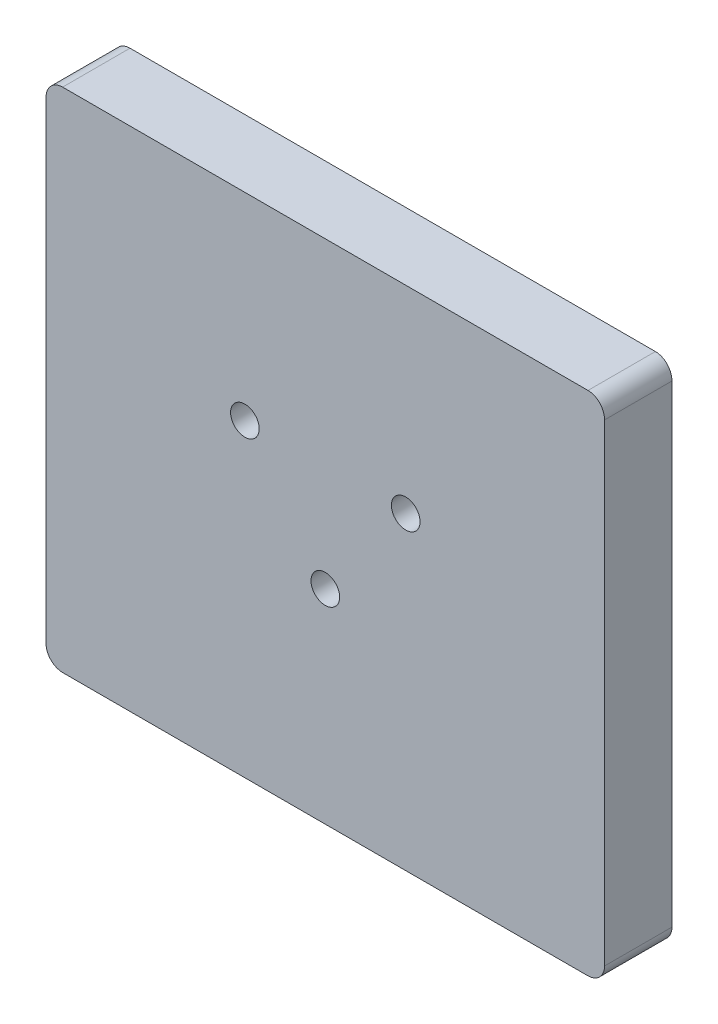
ISO-10303-21;
HEADER;
FILE_DESCRIPTION(('STEP AP214'),'2;1');
FILE_NAME('part.step','',(''),(''),'','','');
FILE_SCHEMA(('AUTOMOTIVE_DESIGN { 1 0 10303 214 1 1 1 1 }'));
ENDSEC;
DATA;
#1=APPLICATION_CONTEXT('core data for automotive mechanical design processes');
#2=APPLICATION_PROTOCOL_DEFINITION('international standard','automotive_design',2000,#1);
#3=PRODUCT_CONTEXT('',#1,'mechanical');
#4=PRODUCT('Part','Part','',(#3));
#5=PRODUCT_RELATED_PRODUCT_CATEGORY('part','',(#4));
#6=PRODUCT_DEFINITION_FORMATION('','',#4);
#7=PRODUCT_DEFINITION_CONTEXT('part definition',#1,'design');
#8=PRODUCT_DEFINITION('design','',#6,#7);
#9=PRODUCT_DEFINITION_SHAPE('','',#8);
#10=(LENGTH_UNIT() NAMED_UNIT(*) SI_UNIT(.MILLI.,.METRE.));
#11=(NAMED_UNIT(*) PLANE_ANGLE_UNIT() SI_UNIT($,.RADIAN.));
#12=(NAMED_UNIT(*) SI_UNIT($,.STERADIAN.) SOLID_ANGLE_UNIT());
#13=UNCERTAINTY_MEASURE_WITH_UNIT(LENGTH_MEASURE(1.E-05),#10,'distance_accuracy_value','');
#14=(GEOMETRIC_REPRESENTATION_CONTEXT(3) GLOBAL_UNCERTAINTY_ASSIGNED_CONTEXT((#13)) GLOBAL_UNIT_ASSIGNED_CONTEXT((#10,
#11,#12)) REPRESENTATION_CONTEXT('',''));
#15=CARTESIAN_POINT('',(0.,0.,0.));
#16=DIRECTION('',(0.,0.,1.));
#17=DIRECTION('',(1.,0.,0.));
#18=AXIS2_PLACEMENT_3D('',#15,#16,#17);
#19=CARTESIAN_POINT('',(0.,-1.26259003663461E-12,-50.8));
#20=DIRECTION('',(0.,0.,-1.));
#21=DIRECTION('',(0.,1.,0.));
#22=AXIS2_PLACEMENT_3D('',#19,#20,#21);
#23=PLANE('',#22);
#24=CARTESIAN_POINT('',(-6.89480048776039E-10,140.918830549792,-50.8000000000035));
#25=DIRECTION('',(0.,0.,-1.));
#26=DIRECTION('',(0.,1.,0.));
#27=AXIS2_PLACEMENT_3D('',#24,#25,#26);
#28=CIRCLE('',#27,10.795);
#29=CARTESIAN_POINT('',(-6.89480048776039E-10,151.713830549792,-50.8000000000037));
#30=VERTEX_POINT('',#29);
#31=EDGE_CURVE('E298',#30,#30,#28,.T.);
#32=ORIENTED_EDGE('',*,*,#31,.T.);
#33=EDGE_LOOP('',(#32));
#34=FACE_BOUND('',#33,.T.);
#35=CARTESIAN_POINT('',(-60.6219373498962,220.459221855586,-50.8000000000055));
#36=DIRECTION('',(0.,0.,-1.));
#37=DIRECTION('',(0.,1.,0.));
#38=AXIS2_PLACEMENT_3D('',#35,#36,#37);
#39=CIRCLE('',#38,10.795);
#40=CARTESIAN_POINT('',(-60.6219373498962,231.254221855586,-50.8000000000057));
#41=VERTEX_POINT('',#40);
#42=EDGE_CURVE('E237',#41,#41,#39,.T.);
#43=ORIENTED_EDGE('',*,*,#42,.T.);
#44=EDGE_LOOP('',(#43));
#45=FACE_BOUND('',#44,.T.);
#46=CARTESIAN_POINT('',(60.6219373498894,220.459221855586,-50.8000000000055));
#47=DIRECTION('',(0.,0.,-1.));
#48=DIRECTION('',(0.,1.,0.));
#49=AXIS2_PLACEMENT_3D('',#46,#47,#48);
#50=CIRCLE('',#49,10.795);
#51=CARTESIAN_POINT('',(60.6219373498894,231.254221855586,-50.8000000000057));
#52=VERTEX_POINT('',#51);
#53=EDGE_CURVE('E300',#52,#52,#50,.T.);
#54=ORIENTED_EDGE('',*,*,#53,.T.);
#55=EDGE_LOOP('',(#54));
#56=FACE_BOUND('',#55,.T.);
#57=CARTESIAN_POINT('',(197.793895445054,0.,-50.8000000000003));
#58=DIRECTION('',(0.,0.,1.));
#59=DIRECTION('',(-1.,-3.80671022278096E-13,0.));
#60=AXIS2_PLACEMENT_3D('',#57,#58,#59);
#61=ELLIPSE('',#60,12.7270401618867,12.7);
#62=CARTESIAN_POINT('',(210.520935606941,0.,-50.8));
#63=VERTEX_POINT('',#62);
#64=CARTESIAN_POINT('',(197.793895445054,-12.7,-50.7999999999996));
#65=VERTEX_POINT('',#64);
#66=EDGE_CURVE('E196',#63,#65,#61,.F.);
#67=ORIENTED_EDGE('',*,*,#66,.F.);
#68=DIRECTION('',(0.,1.,0.));
#69=VECTOR('',#68,1.);
#70=CARTESIAN_POINT('',(210.520935606941,-12.7,-50.8));
#71=LINE('',#70,#69);
#72=CARTESIAN_POINT('',(210.520935606941,356.505933384394,-50.8000000000088));
#73=VERTEX_POINT('',#72);
#74=EDGE_CURVE('E53',#63,#73,#71,.T.);
#75=ORIENTED_EDGE('',*,*,#74,.T.);
#76=CARTESIAN_POINT('',(197.793895445055,356.261568489364,-50.8000000000088));
#77=DIRECTION('',(0.,0.,-1.));
#78=DIRECTION('',(0.215862503296012,0.976423770537557,0.));
#79=AXIS2_PLACEMENT_3D('',#76,#77,#78);
#80=ELLIPSE('',#79,13.2682097322358,12.7);
#81=CARTESIAN_POINT('',(198.028752515511,369.503843151079,-50.8000000000091));
#82=VERTEX_POINT('',#81);
#83=EDGE_CURVE('E184',#82,#73,#80,.T.);
#84=ORIENTED_EDGE('',*,*,#83,.F.);
#85=DIRECTION('',(1.,0.,0.));
#86=VECTOR('',#85,1.);
#87=CARTESIAN_POINT('',(254.,369.50384315108,-50.8000000000095));
#88=LINE('',#87,#86);
#89=CARTESIAN_POINT('',(-198.028752515511,369.50384315108,-50.8000000000003));
#90=VERTEX_POINT('',#89);
#91=EDGE_CURVE('E11',#82,#90,#88,.F.);
#92=ORIENTED_EDGE('',*,*,#91,.T.);
#93=CARTESIAN_POINT('',(-197.793895445055,356.261568489364,-50.8000000000088));
#94=DIRECTION('',(0.,0.,-1.));
#95=DIRECTION('',(-0.215862503296012,0.976423770537557,0.));
#96=AXIS2_PLACEMENT_3D('',#93,#94,#95);
#97=ELLIPSE('',#96,13.2682097322358,12.7);
#98=CARTESIAN_POINT('',(-210.520935606941,356.505933384394,-50.8000000000088));
#99=VERTEX_POINT('',#98);
#100=EDGE_CURVE('E60',#99,#90,#97,.T.);
#101=ORIENTED_EDGE('',*,*,#100,.F.);
#102=DIRECTION('',(0.,1.,0.));
#103=VECTOR('',#102,1.);
#104=CARTESIAN_POINT('',(-210.520935606941,-12.7,-50.8));
#105=LINE('',#104,#103);
#106=CARTESIAN_POINT('',(-210.520935606941,0.,-50.8));
#107=VERTEX_POINT('',#106);
#108=EDGE_CURVE('E132',#107,#99,#105,.T.);
#109=ORIENTED_EDGE('',*,*,#108,.F.);
#110=CARTESIAN_POINT('',(-197.793895445054,0.,-50.8000000000003));
#111=DIRECTION('',(0.,0.,1.));
#112=DIRECTION('',(1.,-3.80671022278096E-13,0.));
#113=AXIS2_PLACEMENT_3D('',#110,#111,#112);
#114=ELLIPSE('',#113,12.7270401618867,12.7);
#115=CARTESIAN_POINT('',(-197.793895445054,-12.7,-50.7999999999996));
#116=VERTEX_POINT('',#115);
#117=EDGE_CURVE('E199',#116,#107,#114,.F.);
#118=ORIENTED_EDGE('',*,*,#117,.F.);
#119=DIRECTION('',(-1.,0.,0.));
#120=VECTOR('',#119,1.);
#121=CARTESIAN_POINT('',(254.,-12.7,-50.7999999999996));
#122=LINE('',#121,#120);
#123=EDGE_CURVE('E172',#65,#116,#122,.T.);
#124=ORIENTED_EDGE('',*,*,#123,.F.);
#125=EDGE_LOOP('',(#67,#75,#84,#92,#101,#109,#118,#124));
#126=FACE_BOUND('',#125,.T.);
#127=ADVANCED_FACE('F44',(#34,#45,#56,#126),#23,.F.);
#128=CARTESIAN_POINT('',(210.520935606941,356.505933384392,-101.600000000009));
#129=DIRECTION('',(-1.,0.,0.));
#130=DIRECTION('',(0.,-1.,0.));
#131=AXIS2_PLACEMENT_3D('',#128,#129,#130);
#132=PLANE('',#131);
#133=ORIENTED_EDGE('',*,*,#74,.F.);
#134=DIRECTION('',(0.,0.,1.));
#135=VECTOR('',#134,1.);
#136=CARTESIAN_POINT('',(210.520935606941,-1.26092176321742E-12,-101.6));
#137=LINE('',#136,#135);
#138=CARTESIAN_POINT('',(210.520935606941,-1.26092176321742E-12,-101.6));
#139=VERTEX_POINT('',#138);
#140=EDGE_CURVE('E207',#139,#63,#137,.T.);
#141=ORIENTED_EDGE('',*,*,#140,.F.);
#142=DIRECTION('',(0.,-1.,0.));
#143=VECTOR('',#142,1.);
#144=CARTESIAN_POINT('',(210.520935606941,356.505933384392,-101.600000000009));
#145=LINE('',#144,#143);
#146=CARTESIAN_POINT('',(210.520935606941,356.505933384392,-101.600000000009));
#147=VERTEX_POINT('',#146);
#148=EDGE_CURVE('E105',#147,#139,#145,.T.);
#149=ORIENTED_EDGE('',*,*,#148,.F.);
#150=DIRECTION('',(0.,0.,1.));
#151=VECTOR('',#150,1.);
#152=CARTESIAN_POINT('',(210.520935606941,356.505933384392,-101.600000000009));
#153=LINE('',#152,#151);
#154=EDGE_CURVE('E203',#147,#73,#153,.T.);
#155=ORIENTED_EDGE('',*,*,#154,.T.);
#156=EDGE_LOOP('',(#133,#141,#149,#155));
#157=FACE_BOUND('',#156,.T.);
#158=ADVANCED_FACE('F230',(#157),#132,.F.);
#159=CARTESIAN_POINT('',(254.,-12.7,25.4));
#160=DIRECTION('',(0.,1.,0.));
#161=DIRECTION('',(0.,0.,1.));
#162=AXIS2_PLACEMENT_3D('',#159,#160,#161);
#163=PLANE('',#162);
#164=DIRECTION('',(0.,0.,1.));
#165=VECTOR('',#164,1.);
#166=CARTESIAN_POINT('',(197.793895445054,-12.7000000000013,-101.6));
#167=LINE('',#166,#165);
#168=CARTESIAN_POINT('',(197.793895445054,-12.7000000000013,-101.6));
#169=VERTEX_POINT('',#168);
#170=EDGE_CURVE('E210',#169,#65,#167,.T.);
#171=ORIENTED_EDGE('',*,*,#170,.T.);
#172=ORIENTED_EDGE('',*,*,#123,.T.);
#173=DIRECTION('',(0.,0.,1.));
#174=VECTOR('',#173,1.);
#175=CARTESIAN_POINT('',(-197.793895445054,-12.7000000000013,-101.6));
#176=LINE('',#175,#174);
#177=CARTESIAN_POINT('',(-197.793895445054,-12.7000000000013,-101.6));
#178=VERTEX_POINT('',#177);
#179=EDGE_CURVE('E257',#178,#116,#176,.T.);
#180=ORIENTED_EDGE('',*,*,#179,.F.);
#181=DIRECTION('',(-1.,0.,0.));
#182=VECTOR('',#181,1.);
#183=CARTESIAN_POINT('',(197.793895445054,-12.7000000000013,-101.6));
#184=LINE('',#183,#182);
#185=EDGE_CURVE('E243',#169,#178,#184,.T.);
#186=ORIENTED_EDGE('',*,*,#185,.F.);
#187=EDGE_LOOP('',(#171,#172,#180,#186));
#188=FACE_BOUND('',#187,.T.);
#189=ADVANCED_FACE('F232',(#188),#163,.F.);
#190=CARTESIAN_POINT('',(-197.793895445054,-1.2625900366346E-12,-101.6));
#191=DIRECTION('',(0.,0.,-1.));
#192=DIRECTION('',(1.,-3.80671022278078E-13,0.));
#193=AXIS2_PLACEMENT_3D('',#190,#191,#192);
#194=ELLIPSE('',#193,12.7270401618867,12.7);
#195=DIRECTION('',(0.,0.,1.));
#196=VECTOR('',#195,1.);
#197=SURFACE_OF_LINEAR_EXTRUSION('',#194,#196);
#198=ORIENTED_EDGE('',*,*,#117,.T.);
#199=DIRECTION('',(0.,0.,1.));
#200=VECTOR('',#199,1.);
#201=CARTESIAN_POINT('',(-210.520935606941,-1.26403236608725E-12,-101.6));
#202=LINE('',#201,#200);
#203=CARTESIAN_POINT('',(-210.520935606941,-1.26403236608725E-12,-101.6));
#204=VERTEX_POINT('',#203);
#205=EDGE_CURVE('E133',#204,#107,#202,.T.);
#206=ORIENTED_EDGE('',*,*,#205,.F.);
#207=EDGE_CURVE('E124',#178,#204,#194,.T.);
#208=ORIENTED_EDGE('',*,*,#207,.F.);
#209=ORIENTED_EDGE('',*,*,#179,.T.);
#210=EDGE_LOOP('',(#198,#206,#208,#209));
#211=FACE_BOUND('',#210,.T.);
#212=ADVANCED_FACE('F248',(#211),#197,.F.);
#213=CARTESIAN_POINT('',(-210.520935606941,-1.26403236608725E-12,-101.6));
#214=DIRECTION('',(1.,0.,0.));
#215=DIRECTION('',(0.,1.,0.));
#216=AXIS2_PLACEMENT_3D('',#213,#214,#215);
#217=PLANE('',#216);
#218=ORIENTED_EDGE('',*,*,#108,.T.);
#219=DIRECTION('',(0.,0.,1.));
#220=VECTOR('',#219,1.);
#221=CARTESIAN_POINT('',(-210.520935606941,356.505933384392,-101.600000000009));
#222=LINE('',#221,#220);
#223=CARTESIAN_POINT('',(-210.520935606941,356.505933384392,-101.600000000009));
#224=VERTEX_POINT('',#223);
#225=EDGE_CURVE('E129',#224,#99,#222,.T.);
#226=ORIENTED_EDGE('',*,*,#225,.F.);
#227=DIRECTION('',(0.,1.,0.));
#228=VECTOR('',#227,1.);
#229=CARTESIAN_POINT('',(-210.520935606941,-1.26403236608725E-12,-101.6));
#230=LINE('',#229,#228);
#231=EDGE_CURVE('E118',#204,#224,#230,.T.);
#232=ORIENTED_EDGE('',*,*,#231,.F.);
#233=ORIENTED_EDGE('',*,*,#205,.T.);
#234=EDGE_LOOP('',(#218,#226,#232,#233));
#235=FACE_BOUND('',#234,.T.);
#236=ADVANCED_FACE('F130',(#235),#217,.F.);
#237=CARTESIAN_POINT('',(-197.793895445055,356.261568489362,-101.600000000009));
#238=DIRECTION('',(0.,0.,-1.));
#239=DIRECTION('',(-0.215862503296012,0.976423770537557,0.));
#240=AXIS2_PLACEMENT_3D('',#237,#238,#239);
#241=ELLIPSE('',#240,13.2682097322358,12.7);
#242=DIRECTION('',(0.,0.,1.));
#243=VECTOR('',#242,1.);
#244=SURFACE_OF_LINEAR_EXTRUSION('',#241,#243);
#245=ORIENTED_EDGE('',*,*,#100,.T.);
#246=DIRECTION('',(0.,0.,1.));
#247=VECTOR('',#246,1.);
#248=CARTESIAN_POINT('',(-198.028752515863,369.503843151078,-101.600000000009));
#249=LINE('',#248,#247);
#250=CARTESIAN_POINT('',(-198.028752515863,369.503843151078,-101.600000000009));
#251=VERTEX_POINT('',#250);
#252=EDGE_CURVE('E134',#251,#90,#249,.T.);
#253=ORIENTED_EDGE('',*,*,#252,.F.);
#254=EDGE_CURVE('E122',#224,#251,#241,.T.);
#255=ORIENTED_EDGE('',*,*,#254,.F.);
#256=ORIENTED_EDGE('',*,*,#225,.T.);
#257=EDGE_LOOP('',(#245,#253,#255,#256));
#258=FACE_BOUND('',#257,.T.);
#259=ADVANCED_FACE('F136',(#258),#244,.F.);
#260=CARTESIAN_POINT('',(197.793895445055,356.261568489362,-101.600000000009));
#261=DIRECTION('',(0.,0.,-1.));
#262=DIRECTION('',(0.,1.,0.));
#263=AXIS2_PLACEMENT_3D('',#260,#261,#262);
#264=PLANE('',#263);
#265=CARTESIAN_POINT('',(-6.89480048776039E-10,140.918830549791,-101.600000000003));
#266=DIRECTION('',(0.,0.,-1.));
#267=DIRECTION('',(0.,1.,0.));
#268=AXIS2_PLACEMENT_3D('',#265,#266,#267);
#269=CIRCLE('',#268,10.795);
#270=CARTESIAN_POINT('',(-6.89480048776039E-10,151.713830549791,-101.600000000004));
#271=VERTEX_POINT('',#270);
#272=EDGE_CURVE('E291',#271,#271,#269,.T.);
#273=ORIENTED_EDGE('',*,*,#272,.F.);
#274=EDGE_LOOP('',(#273));
#275=FACE_BOUND('',#274,.T.);
#276=CARTESIAN_POINT('',(-60.6219373498962,220.459221855585,-101.600000000005));
#277=DIRECTION('',(0.,0.,-1.));
#278=DIRECTION('',(0.,1.,0.));
#279=AXIS2_PLACEMENT_3D('',#276,#277,#278);
#280=CIRCLE('',#279,10.795);
#281=CARTESIAN_POINT('',(-60.6219373498962,231.254221855585,-101.600000000006));
#282=VERTEX_POINT('',#281);
#283=EDGE_CURVE('E295',#282,#282,#280,.T.);
#284=ORIENTED_EDGE('',*,*,#283,.F.);
#285=EDGE_LOOP('',(#284));
#286=FACE_BOUND('',#285,.T.);
#287=CARTESIAN_POINT('',(60.6219373498894,220.459221855585,-101.600000000005));
#288=DIRECTION('',(0.,0.,-1.));
#289=DIRECTION('',(0.,1.,0.));
#290=AXIS2_PLACEMENT_3D('',#287,#288,#289);
#291=CIRCLE('',#290,10.795);
#292=CARTESIAN_POINT('',(60.6219373498894,231.254221855585,-101.600000000006));
#293=VERTEX_POINT('',#292);
#294=EDGE_CURVE('E297',#293,#293,#291,.T.);
#295=ORIENTED_EDGE('',*,*,#294,.F.);
#296=EDGE_LOOP('',(#295));
#297=FACE_BOUND('',#296,.T.);
#298=CARTESIAN_POINT('',(197.793895445055,356.261568489362,-101.600000000009));
#299=DIRECTION('',(0.,0.,-1.));
#300=DIRECTION('',(0.215862503296012,0.976423770537557,0.));
#301=AXIS2_PLACEMENT_3D('',#298,#299,#300);
#302=ELLIPSE('',#301,13.2682097322358,12.7);
#303=CARTESIAN_POINT('',(198.028752515511,369.503843151078,-101.600000000009));
#304=VERTEX_POINT('',#303);
#305=EDGE_CURVE('E233',#304,#147,#302,.T.);
#306=ORIENTED_EDGE('',*,*,#305,.T.);
#307=ORIENTED_EDGE('',*,*,#148,.T.);
#308=CARTESIAN_POINT('',(197.793895445054,-1.2625900366346E-12,-101.6));
#309=DIRECTION('',(0.,0.,-1.));
#310=DIRECTION('',(-1.,-3.80671022278078E-13,0.));
#311=AXIS2_PLACEMENT_3D('',#308,#309,#310);
#312=ELLIPSE('',#311,12.7270401618867,12.7);
#313=EDGE_CURVE('E240',#139,#169,#312,.T.);
#314=ORIENTED_EDGE('',*,*,#313,.T.);
#315=ORIENTED_EDGE('',*,*,#185,.T.);
#316=ORIENTED_EDGE('',*,*,#207,.T.);
#317=ORIENTED_EDGE('',*,*,#231,.T.);
#318=ORIENTED_EDGE('',*,*,#254,.T.);
#319=DIRECTION('',(1.,0.,0.));
#320=VECTOR('',#319,1.);
#321=CARTESIAN_POINT('',(-198.028752515863,369.503843151078,-101.600000000009));
#322=LINE('',#321,#320);
#323=EDGE_CURVE('E69',#251,#304,#322,.T.);
#324=ORIENTED_EDGE('',*,*,#323,.T.);
#325=EDGE_LOOP('',(#306,#307,#314,#315,#316,#317,#318,#324));
#326=FACE_BOUND('',#325,.T.);
#327=ADVANCED_FACE('F120',(#275,#286,#297,#326),#264,.T.);
#328=DIRECTION('',(0.,0.,1.));
#329=VECTOR('',#328,1.);
#330=SURFACE_OF_LINEAR_EXTRUSION('',#302,#329);
#331=ORIENTED_EDGE('',*,*,#83,.T.);
#332=ORIENTED_EDGE('',*,*,#154,.F.);
#333=ORIENTED_EDGE('',*,*,#305,.F.);
#334=DIRECTION('',(0.,0.,1.));
#335=VECTOR('',#334,1.);
#336=CARTESIAN_POINT('',(198.028752515511,369.503843151078,-101.600000000009));
#337=LINE('',#336,#335);
#338=EDGE_CURVE('E138',#304,#82,#337,.T.);
#339=ORIENTED_EDGE('',*,*,#338,.T.);
#340=EDGE_LOOP('',(#331,#332,#333,#339));
#341=FACE_BOUND('',#340,.T.);
#342=ADVANCED_FACE('F220',(#341),#330,.F.);
#343=CARTESIAN_POINT('',(-198.028752515863,369.503843151078,-101.600000000009));
#344=DIRECTION('',(0.,-1.,0.));
#345=DIRECTION('',(0.,0.,-1.));
#346=AXIS2_PLACEMENT_3D('',#343,#344,#345);
#347=PLANE('',#346);
#348=ORIENTED_EDGE('',*,*,#91,.F.);
#349=ORIENTED_EDGE('',*,*,#338,.F.);
#350=ORIENTED_EDGE('',*,*,#323,.F.);
#351=ORIENTED_EDGE('',*,*,#252,.T.);
#352=EDGE_LOOP('',(#348,#349,#350,#351));
#353=FACE_BOUND('',#352,.T.);
#354=ADVANCED_FACE('F148',(#353),#347,.F.);
#355=DIRECTION('',(0.,0.,1.));
#356=VECTOR('',#355,1.);
#357=SURFACE_OF_LINEAR_EXTRUSION('',#312,#356);
#358=ORIENTED_EDGE('',*,*,#66,.T.);
#359=ORIENTED_EDGE('',*,*,#170,.F.);
#360=ORIENTED_EDGE('',*,*,#313,.F.);
#361=ORIENTED_EDGE('',*,*,#140,.T.);
#362=EDGE_LOOP('',(#358,#359,#360,#361));
#363=FACE_BOUND('',#362,.T.);
#364=ADVANCED_FACE('F244',(#363),#357,.F.);
#365=CARTESIAN_POINT('',(60.6219373498894,220.459221855595,311.149999999995));
#366=DIRECTION('',(0.,0.,-1.));
#367=DIRECTION('',(0.,1.,0.));
#368=AXIS2_PLACEMENT_3D('',#365,#366,#367);
#369=CYLINDRICAL_SURFACE('',#368,10.795);
#370=ORIENTED_EDGE('',*,*,#294,.T.);
#371=EDGE_LOOP('',(#370));
#372=FACE_BOUND('',#371,.T.);
#373=ORIENTED_EDGE('',*,*,#53,.F.);
#374=EDGE_LOOP('',(#373));
#375=FACE_BOUND('',#374,.T.);
#376=ADVANCED_FACE('F246',(#372,#375),#369,.F.);
#377=CARTESIAN_POINT('',(-60.6219373498962,220.459221855595,311.149999999995));
#378=DIRECTION('',(0.,0.,-1.));
#379=DIRECTION('',(0.,1.,0.));
#380=AXIS2_PLACEMENT_3D('',#377,#378,#379);
#381=CYLINDRICAL_SURFACE('',#380,10.795);
#382=ORIENTED_EDGE('',*,*,#283,.T.);
#383=EDGE_LOOP('',(#382));
#384=FACE_BOUND('',#383,.T.);
#385=ORIENTED_EDGE('',*,*,#42,.F.);
#386=EDGE_LOOP('',(#385));
#387=FACE_BOUND('',#386,.T.);
#388=ADVANCED_FACE('F270',(#384,#387),#381,.F.);
#389=CARTESIAN_POINT('',(-6.89480048776039E-10,140.9188305498,253.999999999997));
#390=DIRECTION('',(0.,0.,-1.));
#391=DIRECTION('',(0.,1.,0.));
#392=AXIS2_PLACEMENT_3D('',#389,#390,#391);
#393=CYLINDRICAL_SURFACE('',#392,10.795);
#394=ORIENTED_EDGE('',*,*,#272,.T.);
#395=EDGE_LOOP('',(#394));
#396=FACE_BOUND('',#395,.T.);
#397=ORIENTED_EDGE('',*,*,#31,.F.);
#398=EDGE_LOOP('',(#397));
#399=FACE_BOUND('',#398,.T.);
#400=ADVANCED_FACE('F277',(#396,#399),#393,.F.);
#401=CLOSED_SHELL('',(#127,#158,#189,#212,#236,#259,#327,#342,#354,#364,#376,#388,#400));
#402=MANIFOLD_SOLID_BREP('B2',#401);
#403=ADVANCED_BREP_SHAPE_REPRESENTATION('',(#18,#402),#14);
#404=SHAPE_DEFINITION_REPRESENTATION(#9,#403);
ENDSEC;
END-ISO-10303-21;
